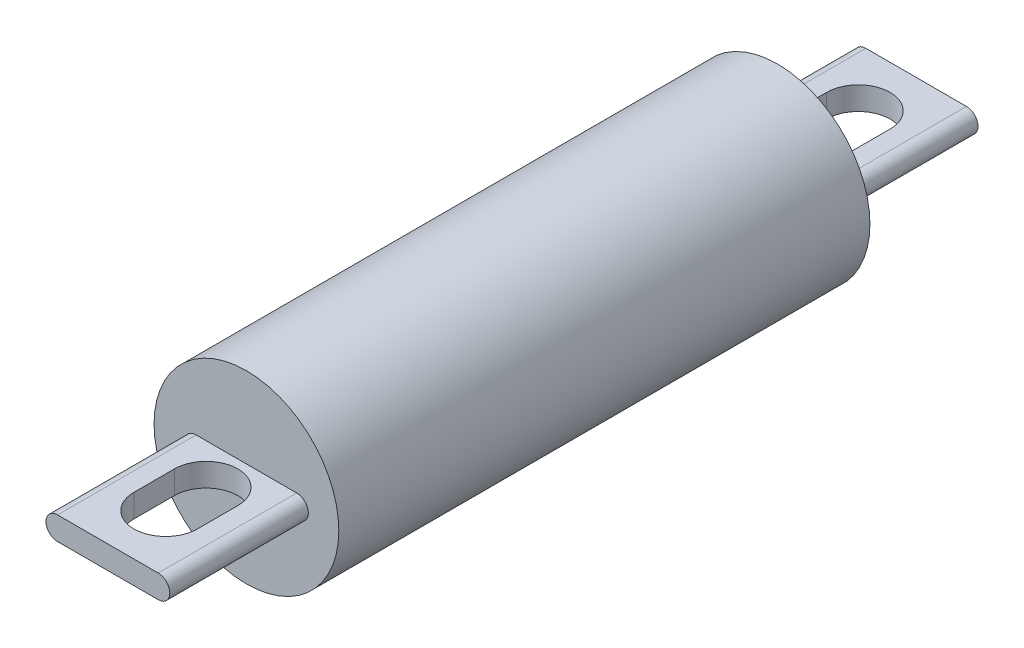
ISO-10303-21;
HEADER;
FILE_DESCRIPTION(('STEP AP214'),'2;1');
FILE_NAME('part.step','',(''),(''),'','','');
FILE_SCHEMA(('AUTOMOTIVE_DESIGN { 1 0 10303 214 1 1 1 1 }'));
ENDSEC;
DATA;
#1=APPLICATION_CONTEXT('core data for automotive mechanical design processes');
#2=APPLICATION_PROTOCOL_DEFINITION('international standard','automotive_design',2000,#1);
#3=PRODUCT_CONTEXT('',#1,'mechanical');
#4=PRODUCT('Part','Part','',(#3));
#5=PRODUCT_RELATED_PRODUCT_CATEGORY('part','',(#4));
#6=PRODUCT_DEFINITION_FORMATION('','',#4);
#7=PRODUCT_DEFINITION_CONTEXT('part definition',#1,'design');
#8=PRODUCT_DEFINITION('design','',#6,#7);
#9=PRODUCT_DEFINITION_SHAPE('','',#8);
#10=(LENGTH_UNIT() NAMED_UNIT(*) SI_UNIT(.MILLI.,.METRE.));
#11=(NAMED_UNIT(*) PLANE_ANGLE_UNIT() SI_UNIT($,.RADIAN.));
#12=(NAMED_UNIT(*) SI_UNIT($,.STERADIAN.) SOLID_ANGLE_UNIT());
#13=UNCERTAINTY_MEASURE_WITH_UNIT(LENGTH_MEASURE(1.E-05),#10,'distance_accuracy_value','');
#14=(GEOMETRIC_REPRESENTATION_CONTEXT(3) GLOBAL_UNCERTAINTY_ASSIGNED_CONTEXT((#13)) GLOBAL_UNIT_ASSIGNED_CONTEXT((#10,
#11,#12)) REPRESENTATION_CONTEXT('',''));
#15=CARTESIAN_POINT('',(0.,0.,0.));
#16=DIRECTION('',(0.,0.,1.));
#17=DIRECTION('',(1.,0.,0.));
#18=AXIS2_PLACEMENT_3D('',#15,#16,#17);
#19=CARTESIAN_POINT('',(-6.92,0.,36.515));
#20=DIRECTION('',(0.,0.,1.));
#21=DIRECTION('',(1.,0.,0.));
#22=AXIS2_PLACEMENT_3D('',#19,#20,#21);
#23=CYLINDRICAL_SURFACE('',#22,1.59);
#24=DIRECTION('',(0.,0.,-1.));
#25=VECTOR('',#24,1.);
#26=CARTESIAN_POINT('',(-6.92,1.59,36.515));
#27=LINE('',#26,#25);
#28=CARTESIAN_POINT('',(-6.92,1.59,36.515));
#29=VERTEX_POINT('',#28);
#30=CARTESIAN_POINT('',(-6.92,1.59,55.565));
#31=VERTEX_POINT('',#30);
#32=EDGE_CURVE('E269',#29,#31,#27,.F.);
#33=ORIENTED_EDGE('',*,*,#32,.F.);
#34=CARTESIAN_POINT('',(-6.92,0.,36.515));
#35=DIRECTION('',(0.,0.,1.));
#36=DIRECTION('',(1.,0.,0.));
#37=AXIS2_PLACEMENT_3D('',#34,#35,#36);
#38=CIRCLE('',#37,1.59);
#39=CARTESIAN_POINT('',(-6.92,-1.59,36.515));
#40=VERTEX_POINT('',#39);
#41=EDGE_CURVE('E11',#29,#40,#38,.T.);
#42=ORIENTED_EDGE('',*,*,#41,.T.);
#43=DIRECTION('',(0.,0.,1.));
#44=VECTOR('',#43,1.);
#45=CARTESIAN_POINT('',(-6.92,-1.59,0.));
#46=LINE('',#45,#44);
#47=CARTESIAN_POINT('',(-6.92,-1.59,55.565));
#48=VERTEX_POINT('',#47);
#49=EDGE_CURVE('E272',#48,#40,#46,.F.);
#50=ORIENTED_EDGE('',*,*,#49,.F.);
#51=CARTESIAN_POINT('',(-6.92,0.,55.565));
#52=DIRECTION('',(0.,0.,-1.));
#53=DIRECTION('',(-1.,0.,0.));
#54=AXIS2_PLACEMENT_3D('',#51,#52,#53);
#55=CIRCLE('',#54,1.59);
#56=EDGE_CURVE('E55',#31,#48,#55,.F.);
#57=ORIENTED_EDGE('',*,*,#56,.F.);
#58=EDGE_LOOP('',(#33,#42,#50,#57));
#59=FACE_BOUND('',#58,.T.);
#60=ADVANCED_FACE('F47',(#59),#23,.T.);
#61=CARTESIAN_POINT('',(6.92,0.,55.565));
#62=DIRECTION('',(0.,0.,-1.));
#63=DIRECTION('',(-1.,0.,0.));
#64=AXIS2_PLACEMENT_3D('',#61,#62,#63);
#65=CYLINDRICAL_SURFACE('',#64,1.59);
#66=DIRECTION('',(0.,0.,1.));
#67=VECTOR('',#66,1.);
#68=CARTESIAN_POINT('',(6.92,1.59,55.565));
#69=LINE('',#68,#67);
#70=CARTESIAN_POINT('',(6.92,1.59,55.565));
#71=VERTEX_POINT('',#70);
#72=CARTESIAN_POINT('',(6.92,1.59,36.515));
#73=VERTEX_POINT('',#72);
#74=EDGE_CURVE('E258',#71,#73,#69,.F.);
#75=ORIENTED_EDGE('',*,*,#74,.F.);
#76=CARTESIAN_POINT('',(6.92,0.,55.565));
#77=DIRECTION('',(0.,0.,-1.));
#78=DIRECTION('',(-1.,0.,0.));
#79=AXIS2_PLACEMENT_3D('',#76,#77,#78);
#80=CIRCLE('',#79,1.59);
#81=CARTESIAN_POINT('',(6.92,-1.59,55.565));
#82=VERTEX_POINT('',#81);
#83=EDGE_CURVE('E264',#82,#71,#80,.F.);
#84=ORIENTED_EDGE('',*,*,#83,.F.);
#85=DIRECTION('',(0.,0.,-1.));
#86=VECTOR('',#85,1.);
#87=CARTESIAN_POINT('',(6.92,-1.59,0.));
#88=LINE('',#87,#86);
#89=CARTESIAN_POINT('',(6.92,-1.59,36.515));
#90=VERTEX_POINT('',#89);
#91=EDGE_CURVE('E261',#90,#82,#88,.F.);
#92=ORIENTED_EDGE('',*,*,#91,.F.);
#93=CARTESIAN_POINT('',(6.92,0.,36.515));
#94=DIRECTION('',(0.,0.,1.));
#95=DIRECTION('',(1.,0.,0.));
#96=AXIS2_PLACEMENT_3D('',#93,#94,#95);
#97=CIRCLE('',#96,1.59);
#98=EDGE_CURVE('E267',#90,#73,#97,.T.);
#99=ORIENTED_EDGE('',*,*,#98,.T.);
#100=EDGE_LOOP('',(#75,#84,#92,#99));
#101=FACE_BOUND('',#100,.T.);
#102=ADVANCED_FACE('F318',(#101),#65,.T.);
#103=CARTESIAN_POINT('',(6.92,0.,-55.565));
#104=DIRECTION('',(0.,0.,-1.));
#105=DIRECTION('',(-1.,0.,0.));
#106=AXIS2_PLACEMENT_3D('',#103,#104,#105);
#107=CYLINDRICAL_SURFACE('',#106,1.59);
#108=DIRECTION('',(0.,0.,1.));
#109=VECTOR('',#108,1.);
#110=CARTESIAN_POINT('',(6.92,-1.59,-55.565));
#111=LINE('',#110,#109);
#112=CARTESIAN_POINT('',(6.92,-1.59,-55.565));
#113=VERTEX_POINT('',#112);
#114=CARTESIAN_POINT('',(6.91999999999999,-1.59,-36.515));
#115=VERTEX_POINT('',#114);
#116=EDGE_CURVE('E248',#113,#115,#111,.T.);
#117=ORIENTED_EDGE('',*,*,#116,.F.);
#118=CARTESIAN_POINT('',(6.92,0.,-55.565));
#119=DIRECTION('',(0.,0.,1.));
#120=DIRECTION('',(1.,0.,0.));
#121=AXIS2_PLACEMENT_3D('',#118,#119,#120);
#122=CIRCLE('',#121,1.59);
#123=CARTESIAN_POINT('',(6.92,1.59,-55.565));
#124=VERTEX_POINT('',#123);
#125=EDGE_CURVE('E254',#124,#113,#122,.F.);
#126=ORIENTED_EDGE('',*,*,#125,.F.);
#127=DIRECTION('',(0.,0.,-1.));
#128=VECTOR('',#127,1.);
#129=CARTESIAN_POINT('',(6.92,1.59,0.));
#130=LINE('',#129,#128);
#131=CARTESIAN_POINT('',(6.91999999999999,1.59,-36.515));
#132=VERTEX_POINT('',#131);
#133=EDGE_CURVE('E251',#132,#124,#130,.T.);
#134=ORIENTED_EDGE('',*,*,#133,.F.);
#135=CARTESIAN_POINT('',(6.92,0.,-36.515));
#136=DIRECTION('',(0.,0.,1.));
#137=DIRECTION('',(1.,0.,0.));
#138=AXIS2_PLACEMENT_3D('',#135,#136,#137);
#139=CIRCLE('',#138,1.59);
#140=EDGE_CURVE('E256',#132,#115,#139,.F.);
#141=ORIENTED_EDGE('',*,*,#140,.T.);
#142=EDGE_LOOP('',(#117,#126,#134,#141));
#143=FACE_BOUND('',#142,.T.);
#144=ADVANCED_FACE('F323',(#143),#107,.T.);
#145=CARTESIAN_POINT('',(-6.92,0.,-55.565));
#146=DIRECTION('',(0.,0.,1.));
#147=DIRECTION('',(1.,0.,0.));
#148=AXIS2_PLACEMENT_3D('',#145,#146,#147);
#149=CYLINDRICAL_SURFACE('',#148,1.59);
#150=DIRECTION('',(0.,0.,1.));
#151=VECTOR('',#150,1.);
#152=CARTESIAN_POINT('',(-6.92,1.59,0.));
#153=LINE('',#152,#151);
#154=CARTESIAN_POINT('',(-6.92,1.59,-55.565));
#155=VERTEX_POINT('',#154);
#156=CARTESIAN_POINT('',(-6.92,1.59,-36.515));
#157=VERTEX_POINT('',#156);
#158=EDGE_CURVE('E235',#155,#157,#153,.T.);
#159=ORIENTED_EDGE('',*,*,#158,.F.);
#160=CARTESIAN_POINT('',(-6.92,0.,-55.565));
#161=DIRECTION('',(0.,0.,1.));
#162=DIRECTION('',(1.,0.,0.));
#163=AXIS2_PLACEMENT_3D('',#160,#161,#162);
#164=CIRCLE('',#163,1.59);
#165=CARTESIAN_POINT('',(-6.92,-1.59,-55.565));
#166=VERTEX_POINT('',#165);
#167=EDGE_CURVE('E243',#166,#155,#164,.F.);
#168=ORIENTED_EDGE('',*,*,#167,.F.);
#169=DIRECTION('',(0.,0.,-1.));
#170=VECTOR('',#169,1.);
#171=CARTESIAN_POINT('',(-6.92,-1.59,-55.565));
#172=LINE('',#171,#170);
#173=CARTESIAN_POINT('',(-6.92,-1.59,-36.515));
#174=VERTEX_POINT('',#173);
#175=EDGE_CURVE('E240',#174,#166,#172,.T.);
#176=ORIENTED_EDGE('',*,*,#175,.F.);
#177=CARTESIAN_POINT('',(-6.92,0.,-36.515));
#178=DIRECTION('',(0.,0.,1.));
#179=DIRECTION('',(1.,0.,0.));
#180=AXIS2_PLACEMENT_3D('',#177,#178,#179);
#181=CIRCLE('',#180,1.59);
#182=EDGE_CURVE('E246',#174,#157,#181,.F.);
#183=ORIENTED_EDGE('',*,*,#182,.T.);
#184=EDGE_LOOP('',(#159,#168,#176,#183));
#185=FACE_BOUND('',#184,.T.);
#186=ADVANCED_FACE('F374',(#185),#149,.T.);
#187=CARTESIAN_POINT('',(0.,0.,36.515));
#188=DIRECTION('',(0.,0.,1.));
#189=DIRECTION('',(1.,0.,0.));
#190=AXIS2_PLACEMENT_3D('',#187,#188,#189);
#191=PLANE('',#190);
#192=ORIENTED_EDGE('',*,*,#98,.F.);
#193=DIRECTION('',(-1.,0.,0.));
#194=VECTOR('',#193,1.);
#195=CARTESIAN_POINT('',(-8.51,-1.59,36.515));
#196=LINE('',#195,#194);
#197=EDGE_CURVE('E279',#90,#40,#196,.T.);
#198=ORIENTED_EDGE('',*,*,#197,.T.);
#199=ORIENTED_EDGE('',*,*,#41,.F.);
#200=DIRECTION('',(-1.,0.,0.));
#201=VECTOR('',#200,1.);
#202=CARTESIAN_POINT('',(-8.51,1.59,36.515));
#203=LINE('',#202,#201);
#204=EDGE_CURVE('E290',#73,#29,#203,.T.);
#205=ORIENTED_EDGE('',*,*,#204,.F.);
#206=EDGE_LOOP('',(#192,#198,#199,#205));
#207=FACE_BOUND('',#206,.T.);
#208=CARTESIAN_POINT('',(0.,0.,36.515));
#209=DIRECTION('',(0.,0.,1.));
#210=DIRECTION('',(1.,0.,0.));
#211=AXIS2_PLACEMENT_3D('',#208,#209,#210);
#212=CIRCLE('',#211,12.7);
#213=CARTESIAN_POINT('',(12.7,0.,36.515));
#214=VERTEX_POINT('',#213);
#215=EDGE_CURVE('E232',#214,#214,#212,.T.);
#216=ORIENTED_EDGE('',*,*,#215,.T.);
#217=EDGE_LOOP('',(#216));
#218=FACE_BOUND('',#217,.T.);
#219=ADVANCED_FACE('F282',(#207,#218),#191,.T.);
#220=CARTESIAN_POINT('',(0.,0.,36.515));
#221=DIRECTION('',(0.,0.,-1.));
#222=DIRECTION('',(-1.,0.,0.));
#223=AXIS2_PLACEMENT_3D('',#220,#221,#222);
#224=CYLINDRICAL_SURFACE('',#223,12.7);
#225=ORIENTED_EDGE('',*,*,#215,.F.);
#226=EDGE_LOOP('',(#225));
#227=FACE_BOUND('',#226,.T.);
#228=CARTESIAN_POINT('',(0.,0.,-36.515));
#229=DIRECTION('',(0.,0.,1.));
#230=DIRECTION('',(1.,0.,0.));
#231=AXIS2_PLACEMENT_3D('',#228,#229,#230);
#232=CIRCLE('',#231,12.7);
#233=CARTESIAN_POINT('',(12.7,0.,-36.515));
#234=VERTEX_POINT('',#233);
#235=EDGE_CURVE('E228',#234,#234,#232,.T.);
#236=ORIENTED_EDGE('',*,*,#235,.T.);
#237=EDGE_LOOP('',(#236));
#238=FACE_BOUND('',#237,.T.);
#239=ADVANCED_FACE('F373',(#227,#238),#224,.T.);
#240=CARTESIAN_POINT('',(0.,0.,-36.515));
#241=DIRECTION('',(0.,0.,1.));
#242=DIRECTION('',(1.,0.,0.));
#243=AXIS2_PLACEMENT_3D('',#240,#241,#242);
#244=PLANE('',#243);
#245=ORIENTED_EDGE('',*,*,#182,.F.);
#246=DIRECTION('',(1.,0.,0.));
#247=VECTOR('',#246,1.);
#248=CARTESIAN_POINT('',(-8.51,-1.59,-36.515));
#249=LINE('',#248,#247);
#250=EDGE_CURVE('E221',#174,#115,#249,.T.);
#251=ORIENTED_EDGE('',*,*,#250,.T.);
#252=ORIENTED_EDGE('',*,*,#140,.F.);
#253=DIRECTION('',(1.,0.,0.));
#254=VECTOR('',#253,1.);
#255=CARTESIAN_POINT('',(-8.51,1.59,-36.515));
#256=LINE('',#255,#254);
#257=EDGE_CURVE('E222',#157,#132,#256,.T.);
#258=ORIENTED_EDGE('',*,*,#257,.F.);
#259=EDGE_LOOP('',(#245,#251,#252,#258));
#260=FACE_BOUND('',#259,.T.);
#261=ORIENTED_EDGE('',*,*,#235,.F.);
#262=EDGE_LOOP('',(#261));
#263=FACE_BOUND('',#262,.T.);
#264=ADVANCED_FACE('F364',(#260,#263),#244,.F.);
#265=CARTESIAN_POINT('',(0.,1.59,0.));
#266=DIRECTION('',(0.,-1.,0.));
#267=DIRECTION('',(0.,0.,-1.));
#268=AXIS2_PLACEMENT_3D('',#265,#266,#267);
#269=PLANE('',#268);
#270=ORIENTED_EDGE('',*,*,#257,.T.);
#271=ORIENTED_EDGE('',*,*,#133,.T.);
#272=DIRECTION('',(-1.,0.,0.));
#273=VECTOR('',#272,1.);
#274=CARTESIAN_POINT('',(-8.51,1.59,-55.565));
#275=LINE('',#274,#273);
#276=EDGE_CURVE('E225',#124,#155,#275,.T.);
#277=ORIENTED_EDGE('',*,*,#276,.T.);
#278=ORIENTED_EDGE('',*,*,#158,.T.);
#279=EDGE_LOOP('',(#270,#271,#277,#278));
#280=FACE_BOUND('',#279,.T.);
#281=CARTESIAN_POINT('',(0.,1.59,-42.06));
#282=DIRECTION('',(0.,1.,0.));
#283=DIRECTION('',(0.,0.,1.));
#284=AXIS2_PLACEMENT_3D('',#281,#282,#283);
#285=CIRCLE('',#284,4.365);
#286=CARTESIAN_POINT('',(-4.365,1.59,-42.06));
#287=VERTEX_POINT('',#286);
#288=CARTESIAN_POINT('',(4.365,1.59,-42.06));
#289=VERTEX_POINT('',#288);
#290=EDGE_CURVE('E190',#287,#289,#285,.T.);
#291=ORIENTED_EDGE('',*,*,#290,.F.);
#292=DIRECTION('',(0.,0.,1.));
#293=VECTOR('',#292,1.);
#294=CARTESIAN_POINT('',(-4.365,1.59,-42.06));
#295=LINE('',#294,#293);
#296=CARTESIAN_POINT('',(-4.365,1.59,-47.62));
#297=VERTEX_POINT('',#296);
#298=EDGE_CURVE('E198',#297,#287,#295,.T.);
#299=ORIENTED_EDGE('',*,*,#298,.F.);
#300=CARTESIAN_POINT('',(0.,1.59,-47.62));
#301=DIRECTION('',(0.,1.,0.));
#302=DIRECTION('',(0.,0.,1.));
#303=AXIS2_PLACEMENT_3D('',#300,#301,#302);
#304=CIRCLE('',#303,4.365);
#305=CARTESIAN_POINT('',(4.365,1.59,-47.62));
#306=VERTEX_POINT('',#305);
#307=EDGE_CURVE('E195',#306,#297,#304,.T.);
#308=ORIENTED_EDGE('',*,*,#307,.F.);
#309=DIRECTION('',(0.,0.,-1.));
#310=VECTOR('',#309,1.);
#311=CARTESIAN_POINT('',(4.365,1.59,-42.06));
#312=LINE('',#311,#310);
#313=EDGE_CURVE('E192',#289,#306,#312,.T.);
#314=ORIENTED_EDGE('',*,*,#313,.F.);
#315=EDGE_LOOP('',(#291,#299,#308,#314));
#316=FACE_BOUND('',#315,.T.);
#317=ADVANCED_FACE('F360',(#280,#316),#269,.F.);
#318=CARTESIAN_POINT('',(0.,-1.59,0.));
#319=DIRECTION('',(0.,-1.,0.));
#320=DIRECTION('',(0.,0.,-1.));
#321=AXIS2_PLACEMENT_3D('',#318,#319,#320);
#322=PLANE('',#321);
#323=DIRECTION('',(-1.,0.,0.));
#324=VECTOR('',#323,1.);
#325=CARTESIAN_POINT('',(-8.51,-1.59,-55.565));
#326=LINE('',#325,#324);
#327=EDGE_CURVE('E226',#113,#166,#326,.T.);
#328=ORIENTED_EDGE('',*,*,#327,.F.);
#329=ORIENTED_EDGE('',*,*,#116,.T.);
#330=ORIENTED_EDGE('',*,*,#250,.F.);
#331=ORIENTED_EDGE('',*,*,#175,.T.);
#332=EDGE_LOOP('',(#328,#329,#330,#331));
#333=FACE_BOUND('',#332,.T.);
#334=DIRECTION('',(0.,0.,1.));
#335=VECTOR('',#334,1.);
#336=CARTESIAN_POINT('',(-4.365,-1.59,-42.06));
#337=LINE('',#336,#335);
#338=CARTESIAN_POINT('',(-4.365,-1.59,-47.62));
#339=VERTEX_POINT('',#338);
#340=CARTESIAN_POINT('',(-4.365,-1.59,-42.06));
#341=VERTEX_POINT('',#340);
#342=EDGE_CURVE('E193',#339,#341,#337,.T.);
#343=ORIENTED_EDGE('',*,*,#342,.T.);
#344=CARTESIAN_POINT('',(0.,-1.59,-42.06));
#345=DIRECTION('',(0.,1.,0.));
#346=DIRECTION('',(0.,0.,1.));
#347=AXIS2_PLACEMENT_3D('',#344,#345,#346);
#348=CIRCLE('',#347,4.365);
#349=CARTESIAN_POINT('',(4.365,-1.59,-42.06));
#350=VERTEX_POINT('',#349);
#351=EDGE_CURVE('E201',#341,#350,#348,.T.);
#352=ORIENTED_EDGE('',*,*,#351,.T.);
#353=DIRECTION('',(0.,0.,-1.));
#354=VECTOR('',#353,1.);
#355=CARTESIAN_POINT('',(4.365,-1.59,-42.06));
#356=LINE('',#355,#354);
#357=CARTESIAN_POINT('',(4.365,-1.59,-47.62));
#358=VERTEX_POINT('',#357);
#359=EDGE_CURVE('E204',#350,#358,#356,.T.);
#360=ORIENTED_EDGE('',*,*,#359,.T.);
#361=CARTESIAN_POINT('',(0.,-1.59,-47.62));
#362=DIRECTION('',(0.,1.,0.));
#363=DIRECTION('',(0.,0.,1.));
#364=AXIS2_PLACEMENT_3D('',#361,#362,#363);
#365=CIRCLE('',#364,4.365);
#366=EDGE_CURVE('E207',#358,#339,#365,.T.);
#367=ORIENTED_EDGE('',*,*,#366,.T.);
#368=EDGE_LOOP('',(#343,#352,#360,#367));
#369=FACE_BOUND('',#368,.T.);
#370=ADVANCED_FACE('F363',(#333,#369),#322,.T.);
#371=CARTESIAN_POINT('',(-8.51,1.59,-55.565));
#372=DIRECTION('',(0.,0.,1.));
#373=DIRECTION('',(1.,0.,0.));
#374=AXIS2_PLACEMENT_3D('',#371,#372,#373);
#375=PLANE('',#374);
#376=ORIENTED_EDGE('',*,*,#276,.F.);
#377=ORIENTED_EDGE('',*,*,#125,.T.);
#378=ORIENTED_EDGE('',*,*,#327,.T.);
#379=ORIENTED_EDGE('',*,*,#167,.T.);
#380=EDGE_LOOP('',(#376,#377,#378,#379));
#381=FACE_BOUND('',#380,.T.);
#382=ADVANCED_FACE('F358',(#381),#375,.F.);
#383=CARTESIAN_POINT('',(0.,1.59,-42.06));
#384=DIRECTION('',(0.,-1.,0.));
#385=DIRECTION('',(0.,0.,-1.));
#386=AXIS2_PLACEMENT_3D('',#383,#384,#385);
#387=CYLINDRICAL_SURFACE('',#386,4.365);
#388=ORIENTED_EDGE('',*,*,#351,.F.);
#389=DIRECTION('',(0.,-1.,0.));
#390=VECTOR('',#389,1.);
#391=CARTESIAN_POINT('',(-4.365,1.59,-42.06));
#392=LINE('',#391,#390);
#393=EDGE_CURVE('E200',#287,#341,#392,.T.);
#394=ORIENTED_EDGE('',*,*,#393,.F.);
#395=ORIENTED_EDGE('',*,*,#290,.T.);
#396=DIRECTION('',(0.,-1.,0.));
#397=VECTOR('',#396,1.);
#398=CARTESIAN_POINT('',(4.365,1.59,-42.06));
#399=LINE('',#398,#397);
#400=EDGE_CURVE('E218',#289,#350,#399,.T.);
#401=ORIENTED_EDGE('',*,*,#400,.T.);
#402=EDGE_LOOP('',(#388,#394,#395,#401));
#403=FACE_BOUND('',#402,.T.);
#404=ADVANCED_FACE('F354',(#403),#387,.F.);
#405=CARTESIAN_POINT('',(4.365,1.59,-42.06));
#406=DIRECTION('',(-1.,0.,0.));
#407=DIRECTION('',(0.,0.,1.));
#408=AXIS2_PLACEMENT_3D('',#405,#406,#407);
#409=PLANE('',#408);
#410=ORIENTED_EDGE('',*,*,#359,.F.);
#411=ORIENTED_EDGE('',*,*,#400,.F.);
#412=ORIENTED_EDGE('',*,*,#313,.T.);
#413=DIRECTION('',(0.,-1.,0.));
#414=VECTOR('',#413,1.);
#415=CARTESIAN_POINT('',(4.365,1.59,-47.62));
#416=LINE('',#415,#414);
#417=EDGE_CURVE('E216',#306,#358,#416,.T.);
#418=ORIENTED_EDGE('',*,*,#417,.T.);
#419=EDGE_LOOP('',(#410,#411,#412,#418));
#420=FACE_BOUND('',#419,.T.);
#421=ADVANCED_FACE('F346',(#420),#409,.T.);
#422=CARTESIAN_POINT('',(0.,1.59,-47.62));
#423=DIRECTION('',(0.,-1.,0.));
#424=DIRECTION('',(0.,0.,-1.));
#425=AXIS2_PLACEMENT_3D('',#422,#423,#424);
#426=CYLINDRICAL_SURFACE('',#425,4.365);
#427=ORIENTED_EDGE('',*,*,#366,.F.);
#428=ORIENTED_EDGE('',*,*,#417,.F.);
#429=ORIENTED_EDGE('',*,*,#307,.T.);
#430=DIRECTION('',(0.,-1.,0.));
#431=VECTOR('',#430,1.);
#432=CARTESIAN_POINT('',(-4.365,1.59,-47.62));
#433=LINE('',#432,#431);
#434=EDGE_CURVE('E214',#297,#339,#433,.T.);
#435=ORIENTED_EDGE('',*,*,#434,.T.);
#436=EDGE_LOOP('',(#427,#428,#429,#435));
#437=FACE_BOUND('',#436,.T.);
#438=ADVANCED_FACE('F340',(#437),#426,.F.);
#439=CARTESIAN_POINT('',(-4.365,1.59,-42.06));
#440=DIRECTION('',(1.,0.,0.));
#441=DIRECTION('',(0.,0.,-1.));
#442=AXIS2_PLACEMENT_3D('',#439,#440,#441);
#443=PLANE('',#442);
#444=ORIENTED_EDGE('',*,*,#342,.F.);
#445=ORIENTED_EDGE('',*,*,#434,.F.);
#446=ORIENTED_EDGE('',*,*,#298,.T.);
#447=ORIENTED_EDGE('',*,*,#393,.T.);
#448=EDGE_LOOP('',(#444,#445,#446,#447));
#449=FACE_BOUND('',#448,.T.);
#450=ADVANCED_FACE('F336',(#449),#443,.T.);
#451=CARTESIAN_POINT('',(0.,1.59,0.));
#452=DIRECTION('',(0.,1.,0.));
#453=DIRECTION('',(0.,0.,1.));
#454=AXIS2_PLACEMENT_3D('',#451,#452,#453);
#455=PLANE('',#454);
#456=ORIENTED_EDGE('',*,*,#204,.T.);
#457=ORIENTED_EDGE('',*,*,#32,.T.);
#458=DIRECTION('',(1.,0.,0.));
#459=VECTOR('',#458,1.);
#460=CARTESIAN_POINT('',(-8.51,1.59,55.565));
#461=LINE('',#460,#459);
#462=EDGE_CURVE('E286',#31,#71,#461,.T.);
#463=ORIENTED_EDGE('',*,*,#462,.T.);
#464=ORIENTED_EDGE('',*,*,#74,.T.);
#465=EDGE_LOOP('',(#456,#457,#463,#464));
#466=FACE_BOUND('',#465,.T.);
#467=DIRECTION('',(0.,0.,1.));
#468=VECTOR('',#467,1.);
#469=CARTESIAN_POINT('',(-4.365,1.59,42.06));
#470=LINE('',#469,#468);
#471=CARTESIAN_POINT('',(-4.365,1.59,42.06));
#472=VERTEX_POINT('',#471);
#473=CARTESIAN_POINT('',(-4.365,1.59,47.62));
#474=VERTEX_POINT('',#473);
#475=EDGE_CURVE('E177',#472,#474,#470,.T.);
#476=ORIENTED_EDGE('',*,*,#475,.F.);
#477=CARTESIAN_POINT('',(0.,1.59,42.06));
#478=DIRECTION('',(0.,1.,0.));
#479=DIRECTION('',(0.,0.,1.));
#480=AXIS2_PLACEMENT_3D('',#477,#478,#479);
#481=CIRCLE('',#480,4.365);
#482=CARTESIAN_POINT('',(4.365,1.59,42.06));
#483=VERTEX_POINT('',#482);
#484=EDGE_CURVE('E181',#483,#472,#481,.T.);
#485=ORIENTED_EDGE('',*,*,#484,.F.);
#486=DIRECTION('',(0.,0.,-1.));
#487=VECTOR('',#486,1.);
#488=CARTESIAN_POINT('',(4.365,1.59,42.06));
#489=LINE('',#488,#487);
#490=CARTESIAN_POINT('',(4.365,1.59,47.62));
#491=VERTEX_POINT('',#490);
#492=EDGE_CURVE('E161',#491,#483,#489,.T.);
#493=ORIENTED_EDGE('',*,*,#492,.F.);
#494=CARTESIAN_POINT('',(0.,1.59,47.62));
#495=DIRECTION('',(0.,1.,0.));
#496=DIRECTION('',(0.,0.,1.));
#497=AXIS2_PLACEMENT_3D('',#494,#495,#496);
#498=CIRCLE('',#497,4.365);
#499=EDGE_CURVE('E173',#474,#491,#498,.T.);
#500=ORIENTED_EDGE('',*,*,#499,.F.);
#501=EDGE_LOOP('',(#476,#485,#493,#500));
#502=FACE_BOUND('',#501,.T.);
#503=ADVANCED_FACE('F180',(#466,#502),#455,.T.);
#504=CARTESIAN_POINT('',(0.,-1.59,0.));
#505=DIRECTION('',(0.,1.,0.));
#506=DIRECTION('',(0.,0.,1.));
#507=AXIS2_PLACEMENT_3D('',#504,#505,#506);
#508=PLANE('',#507);
#509=DIRECTION('',(1.,0.,0.));
#510=VECTOR('',#509,1.);
#511=CARTESIAN_POINT('',(-8.51,-1.59,55.565));
#512=LINE('',#511,#510);
#513=EDGE_CURVE('E280',#48,#82,#512,.T.);
#514=ORIENTED_EDGE('',*,*,#513,.F.);
#515=ORIENTED_EDGE('',*,*,#49,.T.);
#516=ORIENTED_EDGE('',*,*,#197,.F.);
#517=ORIENTED_EDGE('',*,*,#91,.T.);
#518=EDGE_LOOP('',(#514,#515,#516,#517));
#519=FACE_BOUND('',#518,.T.);
#520=CARTESIAN_POINT('',(0.,-1.59,42.06));
#521=DIRECTION('',(0.,1.,0.));
#522=DIRECTION('',(0.,0.,1.));
#523=AXIS2_PLACEMENT_3D('',#520,#521,#522);
#524=CIRCLE('',#523,4.365);
#525=CARTESIAN_POINT('',(4.365,-1.59,42.06));
#526=VERTEX_POINT('',#525);
#527=CARTESIAN_POINT('',(-4.365,-1.59,42.06));
#528=VERTEX_POINT('',#527);
#529=EDGE_CURVE('E185',#526,#528,#524,.T.);
#530=ORIENTED_EDGE('',*,*,#529,.T.);
#531=DIRECTION('',(0.,0.,1.));
#532=VECTOR('',#531,1.);
#533=CARTESIAN_POINT('',(-4.365,-1.59,42.06));
#534=LINE('',#533,#532);
#535=CARTESIAN_POINT('',(-4.365,-1.59,47.62));
#536=VERTEX_POINT('',#535);
#537=EDGE_CURVE('E300',#528,#536,#534,.T.);
#538=ORIENTED_EDGE('',*,*,#537,.T.);
#539=CARTESIAN_POINT('',(0.,-1.59,47.62));
#540=DIRECTION('',(0.,1.,0.));
#541=DIRECTION('',(0.,0.,1.));
#542=AXIS2_PLACEMENT_3D('',#539,#540,#541);
#543=CIRCLE('',#542,4.365);
#544=CARTESIAN_POINT('',(4.365,-1.59,47.62));
#545=VERTEX_POINT('',#544);
#546=EDGE_CURVE('E299',#536,#545,#543,.T.);
#547=ORIENTED_EDGE('',*,*,#546,.T.);
#548=DIRECTION('',(0.,0.,-1.));
#549=VECTOR('',#548,1.);
#550=CARTESIAN_POINT('',(4.365,-1.59,42.06));
#551=LINE('',#550,#549);
#552=EDGE_CURVE('E164',#545,#526,#551,.T.);
#553=ORIENTED_EDGE('',*,*,#552,.T.);
#554=EDGE_LOOP('',(#530,#538,#547,#553));
#555=FACE_BOUND('',#554,.T.);
#556=ADVANCED_FACE('F277',(#519,#555),#508,.F.);
#557=CARTESIAN_POINT('',(-8.51,1.59,55.565));
#558=DIRECTION('',(0.,0.,-1.));
#559=DIRECTION('',(-1.,0.,0.));
#560=AXIS2_PLACEMENT_3D('',#557,#558,#559);
#561=PLANE('',#560);
#562=ORIENTED_EDGE('',*,*,#462,.F.);
#563=ORIENTED_EDGE('',*,*,#56,.T.);
#564=ORIENTED_EDGE('',*,*,#513,.T.);
#565=ORIENTED_EDGE('',*,*,#83,.T.);
#566=EDGE_LOOP('',(#562,#563,#564,#565));
#567=FACE_BOUND('',#566,.T.);
#568=ADVANCED_FACE('F315',(#567),#561,.F.);
#569=CARTESIAN_POINT('',(0.,1.59,42.06));
#570=DIRECTION('',(0.,-1.,0.));
#571=DIRECTION('',(0.,0.,-1.));
#572=AXIS2_PLACEMENT_3D('',#569,#570,#571);
#573=CYLINDRICAL_SURFACE('',#572,4.365);
#574=ORIENTED_EDGE('',*,*,#529,.F.);
#575=DIRECTION('',(0.,-1.,0.));
#576=VECTOR('',#575,1.);
#577=CARTESIAN_POINT('',(4.365,1.59,42.06));
#578=LINE('',#577,#576);
#579=EDGE_CURVE('E168',#483,#526,#578,.T.);
#580=ORIENTED_EDGE('',*,*,#579,.F.);
#581=ORIENTED_EDGE('',*,*,#484,.T.);
#582=DIRECTION('',(0.,-1.,0.));
#583=VECTOR('',#582,1.);
#584=CARTESIAN_POINT('',(-4.365,1.59,42.06));
#585=LINE('',#584,#583);
#586=EDGE_CURVE('E288',#472,#528,#585,.T.);
#587=ORIENTED_EDGE('',*,*,#586,.T.);
#588=EDGE_LOOP('',(#574,#580,#581,#587));
#589=FACE_BOUND('',#588,.T.);
#590=ADVANCED_FACE('F304',(#589),#573,.F.);
#591=CARTESIAN_POINT('',(-4.365,1.59,42.06));
#592=DIRECTION('',(1.,0.,0.));
#593=DIRECTION('',(0.,0.,-1.));
#594=AXIS2_PLACEMENT_3D('',#591,#592,#593);
#595=PLANE('',#594);
#596=ORIENTED_EDGE('',*,*,#537,.F.);
#597=ORIENTED_EDGE('',*,*,#586,.F.);
#598=ORIENTED_EDGE('',*,*,#475,.T.);
#599=DIRECTION('',(0.,-1.,0.));
#600=VECTOR('',#599,1.);
#601=CARTESIAN_POINT('',(-4.365,1.59,47.62));
#602=LINE('',#601,#600);
#603=EDGE_CURVE('E169',#474,#536,#602,.T.);
#604=ORIENTED_EDGE('',*,*,#603,.T.);
#605=EDGE_LOOP('',(#596,#597,#598,#604));
#606=FACE_BOUND('',#605,.T.);
#607=ADVANCED_FACE('F307',(#606),#595,.T.);
#608=CARTESIAN_POINT('',(0.,1.59,47.62));
#609=DIRECTION('',(0.,-1.,0.));
#610=DIRECTION('',(0.,0.,-1.));
#611=AXIS2_PLACEMENT_3D('',#608,#609,#610);
#612=CYLINDRICAL_SURFACE('',#611,4.365);
#613=ORIENTED_EDGE('',*,*,#546,.F.);
#614=ORIENTED_EDGE('',*,*,#603,.F.);
#615=ORIENTED_EDGE('',*,*,#499,.T.);
#616=DIRECTION('',(0.,-1.,0.));
#617=VECTOR('',#616,1.);
#618=CARTESIAN_POINT('',(4.365,1.59,47.62));
#619=LINE('',#618,#617);
#620=EDGE_CURVE('E156',#491,#545,#619,.T.);
#621=ORIENTED_EDGE('',*,*,#620,.T.);
#622=EDGE_LOOP('',(#613,#614,#615,#621));
#623=FACE_BOUND('',#622,.T.);
#624=ADVANCED_FACE('F174',(#623),#612,.F.);
#625=CARTESIAN_POINT('',(4.365,1.59,42.06));
#626=DIRECTION('',(-1.,0.,0.));
#627=DIRECTION('',(0.,0.,1.));
#628=AXIS2_PLACEMENT_3D('',#625,#626,#627);
#629=PLANE('',#628);
#630=ORIENTED_EDGE('',*,*,#552,.F.);
#631=ORIENTED_EDGE('',*,*,#620,.F.);
#632=ORIENTED_EDGE('',*,*,#492,.T.);
#633=ORIENTED_EDGE('',*,*,#579,.T.);
#634=EDGE_LOOP('',(#630,#631,#632,#633));
#635=FACE_BOUND('',#634,.T.);
#636=ADVANCED_FACE('F158',(#635),#629,.T.);
#637=CLOSED_SHELL('',(#60,#102,#144,#186,#219,#239,#264,#317,#370,#382,#404,#421,#438,#450,#503,
#556,#568,#590,#607,#624,#636));
#638=MANIFOLD_SOLID_BREP('B2',#637);
#639=ADVANCED_BREP_SHAPE_REPRESENTATION('',(#18,#638),#14);
#640=SHAPE_DEFINITION_REPRESENTATION(#9,#639);
ENDSEC;
END-ISO-10303-21;
